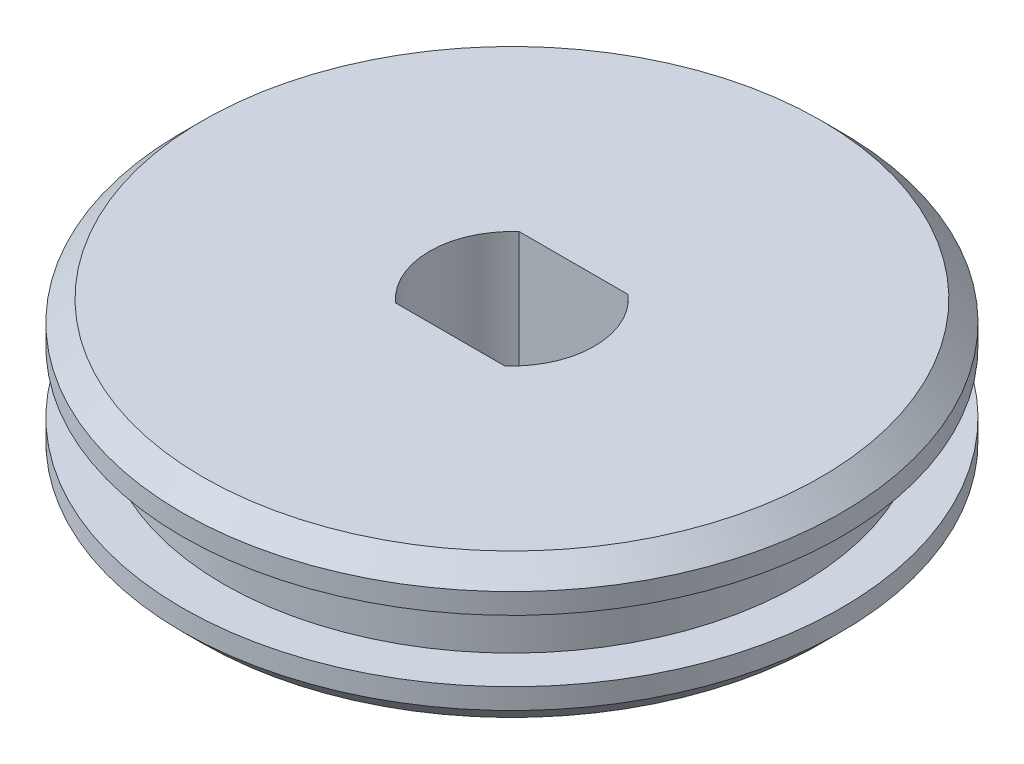
ISO-10303-21;
HEADER;
FILE_DESCRIPTION(('STEP AP214'),'2;1');
FILE_NAME('part.step','',(''),(''),'','','');
FILE_SCHEMA(('AUTOMOTIVE_DESIGN { 1 0 10303 214 1 1 1 1 }'));
ENDSEC;
DATA;
#1=APPLICATION_CONTEXT('core data for automotive mechanical design processes');
#2=APPLICATION_PROTOCOL_DEFINITION('international standard','automotive_design',2000,#1);
#3=PRODUCT_CONTEXT('',#1,'mechanical');
#4=PRODUCT('Part','Part','',(#3));
#5=PRODUCT_RELATED_PRODUCT_CATEGORY('part','',(#4));
#6=PRODUCT_DEFINITION_FORMATION('','',#4);
#7=PRODUCT_DEFINITION_CONTEXT('part definition',#1,'design');
#8=PRODUCT_DEFINITION('design','',#6,#7);
#9=PRODUCT_DEFINITION_SHAPE('','',#8);
#10=(LENGTH_UNIT() NAMED_UNIT(*) SI_UNIT(.MILLI.,.METRE.));
#11=(NAMED_UNIT(*) PLANE_ANGLE_UNIT() SI_UNIT($,.RADIAN.));
#12=(NAMED_UNIT(*) SI_UNIT($,.STERADIAN.) SOLID_ANGLE_UNIT());
#13=UNCERTAINTY_MEASURE_WITH_UNIT(LENGTH_MEASURE(1.E-05),#10,'distance_accuracy_value','');
#14=(GEOMETRIC_REPRESENTATION_CONTEXT(3) GLOBAL_UNCERTAINTY_ASSIGNED_CONTEXT((#13)) GLOBAL_UNIT_ASSIGNED_CONTEXT((#10,
#11,#12)) REPRESENTATION_CONTEXT('',''));
#15=CARTESIAN_POINT('',(0.,0.,0.));
#16=DIRECTION('',(0.,0.,1.));
#17=DIRECTION('',(1.,0.,0.));
#18=AXIS2_PLACEMENT_3D('',#15,#16,#17);
#19=CARTESIAN_POINT('',(0.,2.,0.));
#20=DIRECTION('',(0.,-1.,0.));
#21=DIRECTION('',(0.,0.,-1.));
#22=AXIS2_PLACEMENT_3D('',#19,#20,#21);
#23=CYLINDRICAL_SURFACE('',#22,16.);
#24=CARTESIAN_POINT('',(0.,0.999999999999997,0.));
#25=DIRECTION('',(0.,1.,0.));
#26=DIRECTION('',(0.,0.,1.));
#27=AXIS2_PLACEMENT_3D('',#24,#25,#26);
#28=CIRCLE('',#27,16.);
#29=CARTESIAN_POINT('',(0.,0.999999999999997,16.));
#30=VERTEX_POINT('',#29);
#31=EDGE_CURVE('E55',#30,#30,#28,.T.);
#32=ORIENTED_EDGE('',*,*,#31,.T.);
#33=EDGE_LOOP('',(#32));
#34=FACE_BOUND('',#33,.T.);
#35=CARTESIAN_POINT('',(0.,2.,0.));
#36=DIRECTION('',(0.,1.,0.));
#37=DIRECTION('',(0.,0.,1.));
#38=AXIS2_PLACEMENT_3D('',#35,#36,#37);
#39=CIRCLE('',#38,16.);
#40=CARTESIAN_POINT('',(0.,2.,16.));
#41=VERTEX_POINT('',#40);
#42=EDGE_CURVE('E143',#41,#41,#39,.T.);
#43=ORIENTED_EDGE('',*,*,#42,.F.);
#44=EDGE_LOOP('',(#43));
#45=FACE_BOUND('',#44,.T.);
#46=ADVANCED_FACE('F45',(#34,#45),#23,.T.);
#47=CARTESIAN_POINT('',(0.,2.,0.));
#48=DIRECTION('',(0.,1.,0.));
#49=DIRECTION('',(0.,0.,1.));
#50=AXIS2_PLACEMENT_3D('',#47,#48,#49);
#51=PLANE('',#50);
#52=CARTESIAN_POINT('',(0.,2.,0.));
#53=DIRECTION('',(0.,1.,0.));
#54=DIRECTION('',(0.,0.,1.));
#55=AXIS2_PLACEMENT_3D('',#52,#53,#54);
#56=CIRCLE('',#55,14.);
#57=CARTESIAN_POINT('',(0.,2.,14.));
#58=VERTEX_POINT('',#57);
#59=EDGE_CURVE('E144',#58,#58,#56,.T.);
#60=ORIENTED_EDGE('',*,*,#59,.F.);
#61=EDGE_LOOP('',(#60));
#62=FACE_BOUND('',#61,.T.);
#63=ORIENTED_EDGE('',*,*,#42,.T.);
#64=EDGE_LOOP('',(#63));
#65=FACE_BOUND('',#64,.T.);
#66=ADVANCED_FACE('F173',(#62,#65),#51,.T.);
#67=CARTESIAN_POINT('',(0.,0.,0.));
#68=DIRECTION('',(0.,1.,0.));
#69=DIRECTION('',(0.,0.,1.));
#70=AXIS2_PLACEMENT_3D('',#67,#68,#69);
#71=PLANE('',#70);
#72=CARTESIAN_POINT('',(0.,0.,0.));
#73=DIRECTION('',(0.,1.,0.));
#74=DIRECTION('',(0.,0.,1.));
#75=AXIS2_PLACEMENT_3D('',#72,#73,#74);
#76=CIRCLE('',#75,15.);
#77=CARTESIAN_POINT('',(0.,0.,15.));
#78=VERTEX_POINT('',#77);
#79=EDGE_CURVE('E11',#78,#78,#76,.F.);
#80=ORIENTED_EDGE('',*,*,#79,.T.);
#81=EDGE_LOOP('',(#80));
#82=FACE_BOUND('',#81,.T.);
#83=DIRECTION('',(1.,0.,0.));
#84=VECTOR('',#83,1.);
#85=CARTESIAN_POINT('',(-2.64575131106459,0.,3.));
#86=LINE('',#85,#84);
#87=CARTESIAN_POINT('',(-2.64575131106459,0.,3.));
#88=VERTEX_POINT('',#87);
#89=CARTESIAN_POINT('',(2.64575131106459,0.,3.));
#90=VERTEX_POINT('',#89);
#91=EDGE_CURVE('E97',#88,#90,#86,.T.);
#92=ORIENTED_EDGE('',*,*,#91,.T.);
#93=CARTESIAN_POINT('',(0.,0.,0.));
#94=DIRECTION('',(0.,1.,0.));
#95=DIRECTION('',(0.,0.,1.));
#96=AXIS2_PLACEMENT_3D('',#93,#94,#95);
#97=CIRCLE('',#96,4.);
#98=CARTESIAN_POINT('',(2.64575131106459,0.,-3.));
#99=VERTEX_POINT('',#98);
#100=EDGE_CURVE('E90',#90,#99,#97,.T.);
#101=ORIENTED_EDGE('',*,*,#100,.T.);
#102=DIRECTION('',(-1.,0.,0.));
#103=VECTOR('',#102,1.);
#104=CARTESIAN_POINT('',(-2.64575131106459,0.,-3.));
#105=LINE('',#104,#103);
#106=CARTESIAN_POINT('',(-2.64575131106459,0.,-3.));
#107=VERTEX_POINT('',#106);
#108=EDGE_CURVE('E100',#99,#107,#105,.T.);
#109=ORIENTED_EDGE('',*,*,#108,.T.);
#110=CARTESIAN_POINT('',(0.,0.,0.));
#111=DIRECTION('',(0.,1.,0.));
#112=DIRECTION('',(0.,0.,1.));
#113=AXIS2_PLACEMENT_3D('',#110,#111,#112);
#114=CIRCLE('',#113,4.);
#115=EDGE_CURVE('E62',#107,#88,#114,.T.);
#116=ORIENTED_EDGE('',*,*,#115,.T.);
#117=EDGE_LOOP('',(#92,#101,#109,#116));
#118=FACE_BOUND('',#117,.T.);
#119=ADVANCED_FACE('F105',(#82,#118),#71,.F.);
#120=CARTESIAN_POINT('',(0.,5.,0.));
#121=DIRECTION('',(0.,-1.,0.));
#122=DIRECTION('',(0.,0.,-1.));
#123=AXIS2_PLACEMENT_3D('',#120,#121,#122);
#124=CYLINDRICAL_SURFACE('',#123,14.);
#125=CARTESIAN_POINT('',(0.,5.,0.));
#126=DIRECTION('',(0.,1.,0.));
#127=DIRECTION('',(0.,0.,1.));
#128=AXIS2_PLACEMENT_3D('',#125,#126,#127);
#129=CIRCLE('',#128,14.);
#130=CARTESIAN_POINT('',(0.,5.,14.));
#131=VERTEX_POINT('',#130);
#132=EDGE_CURVE('E139',#131,#131,#129,.T.);
#133=ORIENTED_EDGE('',*,*,#132,.F.);
#134=EDGE_LOOP('',(#133));
#135=FACE_BOUND('',#134,.T.);
#136=ORIENTED_EDGE('',*,*,#59,.T.);
#137=EDGE_LOOP('',(#136));
#138=FACE_BOUND('',#137,.T.);
#139=ADVANCED_FACE('F187',(#135,#138),#124,.T.);
#140=CARTESIAN_POINT('',(0.,7.,0.));
#141=DIRECTION('',(0.,-1.,0.));
#142=DIRECTION('',(0.,0.,-1.));
#143=AXIS2_PLACEMENT_3D('',#140,#141,#142);
#144=CYLINDRICAL_SURFACE('',#143,16.);
#145=CARTESIAN_POINT('',(0.,5.99999999999999,0.));
#146=DIRECTION('',(0.,1.,0.));
#147=DIRECTION('',(0.,0.,1.));
#148=AXIS2_PLACEMENT_3D('',#145,#146,#147);
#149=CIRCLE('',#148,16.);
#150=CARTESIAN_POINT('',(0.,5.99999999999999,16.));
#151=VERTEX_POINT('',#150);
#152=EDGE_CURVE('E155',#151,#151,#149,.F.);
#153=ORIENTED_EDGE('',*,*,#152,.T.);
#154=EDGE_LOOP('',(#153));
#155=FACE_BOUND('',#154,.T.);
#156=CARTESIAN_POINT('',(0.,5.,0.));
#157=DIRECTION('',(0.,1.,0.));
#158=DIRECTION('',(0.,0.,1.));
#159=AXIS2_PLACEMENT_3D('',#156,#157,#158);
#160=CIRCLE('',#159,16.);
#161=CARTESIAN_POINT('',(0.,5.,16.));
#162=VERTEX_POINT('',#161);
#163=EDGE_CURVE('E130',#162,#162,#160,.T.);
#164=ORIENTED_EDGE('',*,*,#163,.T.);
#165=EDGE_LOOP('',(#164));
#166=FACE_BOUND('',#165,.T.);
#167=ADVANCED_FACE('F192',(#155,#166),#144,.T.);
#168=CARTESIAN_POINT('',(0.,7.,0.));
#169=DIRECTION('',(0.,1.,0.));
#170=DIRECTION('',(0.,0.,1.));
#171=AXIS2_PLACEMENT_3D('',#168,#169,#170);
#172=PLANE('',#171);
#173=CARTESIAN_POINT('',(0.,7.,0.));
#174=DIRECTION('',(0.,1.,0.));
#175=DIRECTION('',(0.,0.,1.));
#176=AXIS2_PLACEMENT_3D('',#173,#174,#175);
#177=CIRCLE('',#176,15.);
#178=CARTESIAN_POINT('',(0.,7.,15.));
#179=VERTEX_POINT('',#178);
#180=EDGE_CURVE('E148',#179,#179,#177,.T.);
#181=ORIENTED_EDGE('',*,*,#180,.T.);
#182=EDGE_LOOP('',(#181));
#183=FACE_BOUND('',#182,.T.);
#184=CARTESIAN_POINT('',(0.,7.,0.));
#185=DIRECTION('',(0.,1.,0.));
#186=DIRECTION('',(0.,0.,1.));
#187=AXIS2_PLACEMENT_3D('',#184,#185,#186);
#188=CIRCLE('',#187,4.);
#189=CARTESIAN_POINT('',(2.64575131106459,7.,3.));
#190=VERTEX_POINT('',#189);
#191=CARTESIAN_POINT('',(2.64575131106459,7.,-3.));
#192=VERTEX_POINT('',#191);
#193=EDGE_CURVE('E70',#190,#192,#188,.T.);
#194=ORIENTED_EDGE('',*,*,#193,.F.);
#195=DIRECTION('',(1.,0.,0.));
#196=VECTOR('',#195,1.);
#197=CARTESIAN_POINT('',(-2.64575131106459,7.,3.));
#198=LINE('',#197,#196);
#199=CARTESIAN_POINT('',(-2.64575131106459,7.,3.));
#200=VERTEX_POINT('',#199);
#201=EDGE_CURVE('E108',#200,#190,#198,.T.);
#202=ORIENTED_EDGE('',*,*,#201,.F.);
#203=CARTESIAN_POINT('',(0.,7.,0.));
#204=DIRECTION('',(0.,1.,0.));
#205=DIRECTION('',(0.,0.,1.));
#206=AXIS2_PLACEMENT_3D('',#203,#204,#205);
#207=CIRCLE('',#206,4.);
#208=CARTESIAN_POINT('',(-2.64575131106459,7.,-3.));
#209=VERTEX_POINT('',#208);
#210=EDGE_CURVE('E112',#209,#200,#207,.T.);
#211=ORIENTED_EDGE('',*,*,#210,.F.);
#212=DIRECTION('',(-1.,0.,0.));
#213=VECTOR('',#212,1.);
#214=CARTESIAN_POINT('',(-2.64575131106459,7.,-3.));
#215=LINE('',#214,#213);
#216=EDGE_CURVE('E121',#192,#209,#215,.T.);
#217=ORIENTED_EDGE('',*,*,#216,.F.);
#218=EDGE_LOOP('',(#194,#202,#211,#217));
#219=FACE_BOUND('',#218,.T.);
#220=ADVANCED_FACE('F196',(#183,#219),#172,.T.);
#221=CARTESIAN_POINT('',(0.,5.,0.));
#222=DIRECTION('',(0.,1.,0.));
#223=DIRECTION('',(0.,0.,1.));
#224=AXIS2_PLACEMENT_3D('',#221,#222,#223);
#225=PLANE('',#224);
#226=ORIENTED_EDGE('',*,*,#132,.T.);
#227=EDGE_LOOP('',(#226));
#228=FACE_BOUND('',#227,.T.);
#229=ORIENTED_EDGE('',*,*,#163,.F.);
#230=EDGE_LOOP('',(#229));
#231=FACE_BOUND('',#230,.T.);
#232=ADVANCED_FACE('F198',(#228,#231),#225,.F.);
#233=CARTESIAN_POINT('',(0.,0.,0.));
#234=DIRECTION('',(0.,1.,0.));
#235=DIRECTION('',(0.,0.,1.));
#236=AXIS2_PLACEMENT_3D('',#233,#234,#235);
#237=CYLINDRICAL_SURFACE('',#236,4.);
#238=ORIENTED_EDGE('',*,*,#193,.T.);
#239=DIRECTION('',(0.,1.,0.));
#240=VECTOR('',#239,1.);
#241=CARTESIAN_POINT('',(2.64575131106459,0.,-3.));
#242=LINE('',#241,#240);
#243=EDGE_CURVE('E86',#99,#192,#242,.T.);
#244=ORIENTED_EDGE('',*,*,#243,.F.);
#245=ORIENTED_EDGE('',*,*,#100,.F.);
#246=DIRECTION('',(0.,1.,0.));
#247=VECTOR('',#246,1.);
#248=CARTESIAN_POINT('',(2.64575131106459,0.,3.));
#249=LINE('',#248,#247);
#250=EDGE_CURVE('E127',#90,#190,#249,.T.);
#251=ORIENTED_EDGE('',*,*,#250,.T.);
#252=EDGE_LOOP('',(#238,#244,#245,#251));
#253=FACE_BOUND('',#252,.T.);
#254=ADVANCED_FACE('F88',(#253),#237,.F.);
#255=CARTESIAN_POINT('',(-2.64575131106459,0.,3.));
#256=DIRECTION('',(0.,0.,1.));
#257=DIRECTION('',(1.,0.,0.));
#258=AXIS2_PLACEMENT_3D('',#255,#256,#257);
#259=PLANE('',#258);
#260=ORIENTED_EDGE('',*,*,#201,.T.);
#261=ORIENTED_EDGE('',*,*,#250,.F.);
#262=ORIENTED_EDGE('',*,*,#91,.F.);
#263=DIRECTION('',(0.,1.,0.));
#264=VECTOR('',#263,1.);
#265=CARTESIAN_POINT('',(-2.64575131106459,0.,3.));
#266=LINE('',#265,#264);
#267=EDGE_CURVE('E131',#88,#200,#266,.T.);
#268=ORIENTED_EDGE('',*,*,#267,.T.);
#269=EDGE_LOOP('',(#260,#261,#262,#268));
#270=FACE_BOUND('',#269,.T.);
#271=ADVANCED_FACE('F207',(#270),#259,.F.);
#272=CARTESIAN_POINT('',(0.,0.,0.));
#273=DIRECTION('',(0.,1.,0.));
#274=DIRECTION('',(0.,0.,1.));
#275=AXIS2_PLACEMENT_3D('',#272,#273,#274);
#276=CYLINDRICAL_SURFACE('',#275,4.);
#277=ORIENTED_EDGE('',*,*,#210,.T.);
#278=ORIENTED_EDGE('',*,*,#267,.F.);
#279=ORIENTED_EDGE('',*,*,#115,.F.);
#280=DIRECTION('',(0.,1.,0.));
#281=VECTOR('',#280,1.);
#282=CARTESIAN_POINT('',(-2.64575131106459,0.,-3.));
#283=LINE('',#282,#281);
#284=EDGE_CURVE('E96',#107,#209,#283,.T.);
#285=ORIENTED_EDGE('',*,*,#284,.T.);
#286=EDGE_LOOP('',(#277,#278,#279,#285));
#287=FACE_BOUND('',#286,.T.);
#288=ADVANCED_FACE('F210',(#287),#276,.F.);
#289=CARTESIAN_POINT('',(-2.64575131106459,0.,-3.));
#290=DIRECTION('',(0.,0.,-1.));
#291=DIRECTION('',(-1.,0.,0.));
#292=AXIS2_PLACEMENT_3D('',#289,#290,#291);
#293=PLANE('',#292);
#294=ORIENTED_EDGE('',*,*,#216,.T.);
#295=ORIENTED_EDGE('',*,*,#284,.F.);
#296=ORIENTED_EDGE('',*,*,#108,.F.);
#297=ORIENTED_EDGE('',*,*,#243,.T.);
#298=EDGE_LOOP('',(#294,#295,#296,#297));
#299=FACE_BOUND('',#298,.T.);
#300=ADVANCED_FACE('F101',(#299),#293,.F.);
#301=CARTESIAN_POINT('',(0.,7.,0.));
#302=DIRECTION('',(0.,-1.,0.));
#303=DIRECTION('',(0.,0.,-1.));
#304=AXIS2_PLACEMENT_3D('',#301,#302,#303);
#305=CONICAL_SURFACE('',#304,15.,0.785398163397445);
#306=ORIENTED_EDGE('',*,*,#152,.F.);
#307=EDGE_LOOP('',(#306));
#308=FACE_BOUND('',#307,.T.);
#309=ORIENTED_EDGE('',*,*,#180,.F.);
#310=EDGE_LOOP('',(#309));
#311=FACE_BOUND('',#310,.T.);
#312=ADVANCED_FACE('F165',(#308,#311),#305,.T.);
#313=CARTESIAN_POINT('',(0.,0.999999999999997,0.));
#314=DIRECTION('',(0.,1.,0.));
#315=DIRECTION('',(0.,0.,1.));
#316=AXIS2_PLACEMENT_3D('',#313,#314,#315);
#317=CONICAL_SURFACE('',#316,16.,0.785398163397452);
#318=ORIENTED_EDGE('',*,*,#79,.F.);
#319=EDGE_LOOP('',(#318));
#320=FACE_BOUND('',#319,.T.);
#321=ORIENTED_EDGE('',*,*,#31,.F.);
#322=EDGE_LOOP('',(#321));
#323=FACE_BOUND('',#322,.T.);
#324=ADVANCED_FACE('F48',(#320,#323),#317,.T.);
#325=CLOSED_SHELL('',(#46,#66,#119,#139,#167,#220,#232,#254,#271,#288,#300,#312,#324));
#326=MANIFOLD_SOLID_BREP('B2',#325);
#327=ADVANCED_BREP_SHAPE_REPRESENTATION('',(#18,#326),#14);
#328=SHAPE_DEFINITION_REPRESENTATION(#9,#327);
ENDSEC;
END-ISO-10303-21;
